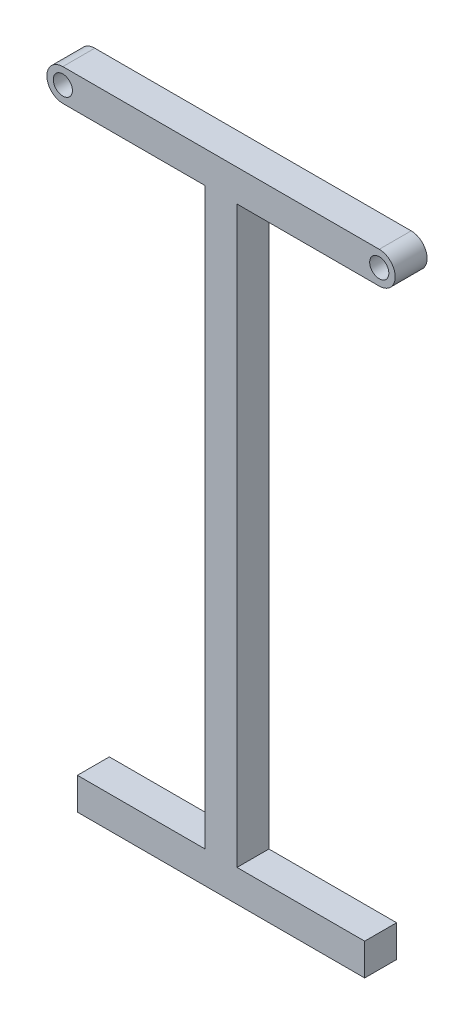
ISO-10303-21;
HEADER;
FILE_DESCRIPTION(('STEP AP214'),'2;1');
FILE_NAME('part.step','',(''),(''),'','','');
FILE_SCHEMA(('AUTOMOTIVE_DESIGN { 1 0 10303 214 1 1 1 1 }'));
ENDSEC;
DATA;
#1=APPLICATION_CONTEXT('core data for automotive mechanical design processes');
#2=APPLICATION_PROTOCOL_DEFINITION('international standard','automotive_design',2000,#1);
#3=PRODUCT_CONTEXT('',#1,'mechanical');
#4=PRODUCT('Part','Part','',(#3));
#5=PRODUCT_RELATED_PRODUCT_CATEGORY('part','',(#4));
#6=PRODUCT_DEFINITION_FORMATION('','',#4);
#7=PRODUCT_DEFINITION_CONTEXT('part definition',#1,'design');
#8=PRODUCT_DEFINITION('design','',#6,#7);
#9=PRODUCT_DEFINITION_SHAPE('','',#8);
#10=(LENGTH_UNIT() NAMED_UNIT(*) SI_UNIT(.MILLI.,.METRE.));
#11=(NAMED_UNIT(*) PLANE_ANGLE_UNIT() SI_UNIT($,.RADIAN.));
#12=(NAMED_UNIT(*) SI_UNIT($,.STERADIAN.) SOLID_ANGLE_UNIT());
#13=UNCERTAINTY_MEASURE_WITH_UNIT(LENGTH_MEASURE(1.E-05),#10,'distance_accuracy_value','');
#14=(GEOMETRIC_REPRESENTATION_CONTEXT(3) GLOBAL_UNCERTAINTY_ASSIGNED_CONTEXT((#13)) GLOBAL_UNIT_ASSIGNED_CONTEXT((#10,
#11,#12)) REPRESENTATION_CONTEXT('',''));
#15=CARTESIAN_POINT('',(0.,0.,0.));
#16=DIRECTION('',(0.,0.,1.));
#17=DIRECTION('',(1.,0.,0.));
#18=AXIS2_PLACEMENT_3D('',#15,#16,#17);
#19=CARTESIAN_POINT('',(-24.78125,47.5,2.5));
#20=DIRECTION('',(0.,0.,1.));
#21=DIRECTION('',(1.,0.,0.));
#22=AXIS2_PLACEMENT_3D('',#19,#20,#21);
#23=PLANE('',#22);
#24=CARTESIAN_POINT('',(24.78125,47.5,2.5));
#25=DIRECTION('',(0.,0.,1.));
#26=DIRECTION('',(1.,0.,0.));
#27=AXIS2_PLACEMENT_3D('',#24,#25,#26);
#28=CIRCLE('',#27,1.49999999999999);
#29=CARTESIAN_POINT('',(26.28125,47.5,2.5));
#30=VERTEX_POINT('',#29);
#31=EDGE_CURVE('E160',#30,#30,#28,.T.);
#32=ORIENTED_EDGE('',*,*,#31,.F.);
#33=EDGE_LOOP('',(#32));
#34=FACE_BOUND('',#33,.T.);
#35=CARTESIAN_POINT('',(-24.78125,47.5,2.5));
#36=DIRECTION('',(0.,0.,1.));
#37=DIRECTION('',(1.,0.,0.));
#38=AXIS2_PLACEMENT_3D('',#35,#36,#37);
#39=CIRCLE('',#38,2.50000000000001);
#40=CARTESIAN_POINT('',(-24.78125,50.,2.5));
#41=VERTEX_POINT('',#40);
#42=CARTESIAN_POINT('',(-24.78125,45.,2.5));
#43=VERTEX_POINT('',#42);
#44=EDGE_CURVE('E179',#41,#43,#39,.T.);
#45=ORIENTED_EDGE('',*,*,#44,.T.);
#46=DIRECTION('',(1.,0.,0.));
#47=VECTOR('',#46,1.);
#48=CARTESIAN_POINT('',(-24.78125,45.,2.5));
#49=LINE('',#48,#47);
#50=CARTESIAN_POINT('',(-2.50000000000002,45.,2.5));
#51=VERTEX_POINT('',#50);
#52=EDGE_CURVE('E107',#43,#51,#49,.T.);
#53=ORIENTED_EDGE('',*,*,#52,.T.);
#54=DIRECTION('',(0.,-1.,0.));
#55=VECTOR('',#54,1.);
#56=CARTESIAN_POINT('',(-2.50000000000002,45.,2.5));
#57=LINE('',#56,#55);
#58=CARTESIAN_POINT('',(-2.50000000000002,-45.,2.5));
#59=VERTEX_POINT('',#58);
#60=EDGE_CURVE('E206',#51,#59,#57,.T.);
#61=ORIENTED_EDGE('',*,*,#60,.T.);
#62=DIRECTION('',(-1.,0.,0.));
#63=VECTOR('',#62,1.);
#64=CARTESIAN_POINT('',(-22.5,-45.,2.5));
#65=LINE('',#64,#63);
#66=CARTESIAN_POINT('',(-22.5,-45.,2.5));
#67=VERTEX_POINT('',#66);
#68=EDGE_CURVE('E225',#59,#67,#65,.T.);
#69=ORIENTED_EDGE('',*,*,#68,.T.);
#70=DIRECTION('',(0.,-1.,0.));
#71=VECTOR('',#70,1.);
#72=CARTESIAN_POINT('',(-22.5,-50.,2.5));
#73=LINE('',#72,#71);
#74=CARTESIAN_POINT('',(-22.5,-50.,2.5));
#75=VERTEX_POINT('',#74);
#76=EDGE_CURVE('E222',#67,#75,#73,.T.);
#77=ORIENTED_EDGE('',*,*,#76,.T.);
#78=DIRECTION('',(1.,0.,0.));
#79=VECTOR('',#78,1.);
#80=CARTESIAN_POINT('',(-22.5,-50.,2.5));
#81=LINE('',#80,#79);
#82=CARTESIAN_POINT('',(22.5,-50.,2.5));
#83=VERTEX_POINT('',#82);
#84=EDGE_CURVE('E224',#75,#83,#81,.T.);
#85=ORIENTED_EDGE('',*,*,#84,.T.);
#86=DIRECTION('',(0.,1.,0.));
#87=VECTOR('',#86,1.);
#88=CARTESIAN_POINT('',(22.5,-50.,2.5));
#89=LINE('',#88,#87);
#90=CARTESIAN_POINT('',(22.5,-45.,2.5));
#91=VERTEX_POINT('',#90);
#92=EDGE_CURVE('E227',#83,#91,#89,.T.);
#93=ORIENTED_EDGE('',*,*,#92,.T.);
#94=DIRECTION('',(-1.,0.,0.));
#95=VECTOR('',#94,1.);
#96=CARTESIAN_POINT('',(2.50000000000002,-45.,2.5));
#97=LINE('',#96,#95);
#98=CARTESIAN_POINT('',(2.50000000000002,-45.,2.5));
#99=VERTEX_POINT('',#98);
#100=EDGE_CURVE('E233',#91,#99,#97,.T.);
#101=ORIENTED_EDGE('',*,*,#100,.T.);
#102=DIRECTION('',(0.,1.,0.));
#103=VECTOR('',#102,1.);
#104=CARTESIAN_POINT('',(2.50000000000002,45.,2.5));
#105=LINE('',#104,#103);
#106=CARTESIAN_POINT('',(2.50000000000002,45.,2.5));
#107=VERTEX_POINT('',#106);
#108=EDGE_CURVE('E138',#99,#107,#105,.T.);
#109=ORIENTED_EDGE('',*,*,#108,.T.);
#110=DIRECTION('',(1.,0.,0.));
#111=VECTOR('',#110,1.);
#112=CARTESIAN_POINT('',(2.50000000000002,45.,2.5));
#113=LINE('',#112,#111);
#114=CARTESIAN_POINT('',(24.78125,45.,2.5));
#115=VERTEX_POINT('',#114);
#116=EDGE_CURVE('E132',#107,#115,#113,.T.);
#117=ORIENTED_EDGE('',*,*,#116,.T.);
#118=CARTESIAN_POINT('',(24.78125,47.5,2.5));
#119=DIRECTION('',(0.,0.,1.));
#120=DIRECTION('',(1.,0.,0.));
#121=AXIS2_PLACEMENT_3D('',#118,#119,#120);
#122=CIRCLE('',#121,2.5);
#123=CARTESIAN_POINT('',(24.78125,50.,2.5));
#124=VERTEX_POINT('',#123);
#125=EDGE_CURVE('E136',#115,#124,#122,.T.);
#126=ORIENTED_EDGE('',*,*,#125,.T.);
#127=DIRECTION('',(-1.,0.,0.));
#128=VECTOR('',#127,1.);
#129=CARTESIAN_POINT('',(-24.78125,50.,2.5));
#130=LINE('',#129,#128);
#131=EDGE_CURVE('E52',#124,#41,#130,.T.);
#132=ORIENTED_EDGE('',*,*,#131,.T.);
#133=EDGE_LOOP('',(#45,#53,#61,#69,#77,#85,#93,#101,#109,#117,#126,#132));
#134=FACE_BOUND('',#133,.T.);
#135=CARTESIAN_POINT('',(-24.78125,47.5,2.5));
#136=DIRECTION('',(0.,0.,1.));
#137=DIRECTION('',(1.,0.,0.));
#138=AXIS2_PLACEMENT_3D('',#135,#136,#137);
#139=CIRCLE('',#138,1.5);
#140=CARTESIAN_POINT('',(-23.28125,47.5,2.5));
#141=VERTEX_POINT('',#140);
#142=EDGE_CURVE('E275',#141,#141,#139,.T.);
#143=ORIENTED_EDGE('',*,*,#142,.F.);
#144=EDGE_LOOP('',(#143));
#145=FACE_BOUND('',#144,.T.);
#146=ADVANCED_FACE('F35',(#34,#134,#145),#23,.T.);
#147=CARTESIAN_POINT('',(-24.78125,47.5,-2.5));
#148=DIRECTION('',(0.,0.,1.));
#149=DIRECTION('',(1.,0.,0.));
#150=AXIS2_PLACEMENT_3D('',#147,#148,#149);
#151=PLANE('',#150);
#152=CARTESIAN_POINT('',(-24.78125,47.5,-2.5));
#153=DIRECTION('',(0.,0.,1.));
#154=DIRECTION('',(1.,0.,0.));
#155=AXIS2_PLACEMENT_3D('',#152,#153,#154);
#156=CIRCLE('',#155,2.50000000000001);
#157=CARTESIAN_POINT('',(-24.78125,50.,-2.5));
#158=VERTEX_POINT('',#157);
#159=CARTESIAN_POINT('',(-24.78125,45.,-2.5));
#160=VERTEX_POINT('',#159);
#161=EDGE_CURVE('E156',#158,#160,#156,.T.);
#162=ORIENTED_EDGE('',*,*,#161,.F.);
#163=DIRECTION('',(-1.,0.,0.));
#164=VECTOR('',#163,1.);
#165=CARTESIAN_POINT('',(-24.78125,50.,-2.5));
#166=LINE('',#165,#164);
#167=CARTESIAN_POINT('',(24.78125,50.,-2.5));
#168=VERTEX_POINT('',#167);
#169=EDGE_CURVE('E99',#168,#158,#166,.T.);
#170=ORIENTED_EDGE('',*,*,#169,.F.);
#171=CARTESIAN_POINT('',(24.78125,47.5,-2.5));
#172=DIRECTION('',(0.,0.,1.));
#173=DIRECTION('',(1.,0.,0.));
#174=AXIS2_PLACEMENT_3D('',#171,#172,#173);
#175=CIRCLE('',#174,2.5);
#176=CARTESIAN_POINT('',(24.78125,45.,-2.5));
#177=VERTEX_POINT('',#176);
#178=EDGE_CURVE('E93',#177,#168,#175,.T.);
#179=ORIENTED_EDGE('',*,*,#178,.F.);
#180=DIRECTION('',(1.,0.,0.));
#181=VECTOR('',#180,1.);
#182=CARTESIAN_POINT('',(2.50000000000002,45.,-2.5));
#183=LINE('',#182,#181);
#184=CARTESIAN_POINT('',(2.50000000000002,45.,-2.5));
#185=VERTEX_POINT('',#184);
#186=EDGE_CURVE('E146',#185,#177,#183,.T.);
#187=ORIENTED_EDGE('',*,*,#186,.F.);
#188=DIRECTION('',(0.,1.,0.));
#189=VECTOR('',#188,1.);
#190=CARTESIAN_POINT('',(2.50000000000002,45.,-2.5));
#191=LINE('',#190,#189);
#192=CARTESIAN_POINT('',(2.50000000000002,-45.,-2.5));
#193=VERTEX_POINT('',#192);
#194=EDGE_CURVE('E174',#193,#185,#191,.T.);
#195=ORIENTED_EDGE('',*,*,#194,.F.);
#196=DIRECTION('',(-1.,0.,0.));
#197=VECTOR('',#196,1.);
#198=CARTESIAN_POINT('',(2.50000000000002,-45.,-2.5));
#199=LINE('',#198,#197);
#200=CARTESIAN_POINT('',(22.5,-45.,-2.5));
#201=VERTEX_POINT('',#200);
#202=EDGE_CURVE('E172',#201,#193,#199,.T.);
#203=ORIENTED_EDGE('',*,*,#202,.F.);
#204=DIRECTION('',(0.,1.,0.));
#205=VECTOR('',#204,1.);
#206=CARTESIAN_POINT('',(22.5,-50.,-2.5));
#207=LINE('',#206,#205);
#208=CARTESIAN_POINT('',(22.5,-50.,-2.5));
#209=VERTEX_POINT('',#208);
#210=EDGE_CURVE('E170',#209,#201,#207,.T.);
#211=ORIENTED_EDGE('',*,*,#210,.F.);
#212=DIRECTION('',(1.,0.,0.));
#213=VECTOR('',#212,1.);
#214=CARTESIAN_POINT('',(-22.5,-50.,-2.5));
#215=LINE('',#214,#213);
#216=CARTESIAN_POINT('',(-22.5,-50.,-2.5));
#217=VERTEX_POINT('',#216);
#218=EDGE_CURVE('E168',#217,#209,#215,.T.);
#219=ORIENTED_EDGE('',*,*,#218,.F.);
#220=DIRECTION('',(0.,-1.,0.));
#221=VECTOR('',#220,1.);
#222=CARTESIAN_POINT('',(-22.5,-50.,-2.5));
#223=LINE('',#222,#221);
#224=CARTESIAN_POINT('',(-22.5,-45.,-2.5));
#225=VERTEX_POINT('',#224);
#226=EDGE_CURVE('E166',#225,#217,#223,.T.);
#227=ORIENTED_EDGE('',*,*,#226,.F.);
#228=DIRECTION('',(-1.,0.,0.));
#229=VECTOR('',#228,1.);
#230=CARTESIAN_POINT('',(-22.5,-45.,-2.5));
#231=LINE('',#230,#229);
#232=CARTESIAN_POINT('',(-2.50000000000002,-45.,-2.5));
#233=VERTEX_POINT('',#232);
#234=EDGE_CURVE('E164',#233,#225,#231,.T.);
#235=ORIENTED_EDGE('',*,*,#234,.F.);
#236=DIRECTION('',(0.,-1.,0.));
#237=VECTOR('',#236,1.);
#238=CARTESIAN_POINT('',(-2.50000000000002,45.,-2.5));
#239=LINE('',#238,#237);
#240=CARTESIAN_POINT('',(-2.50000000000002,45.,-2.5));
#241=VERTEX_POINT('',#240);
#242=EDGE_CURVE('E162',#241,#233,#239,.T.);
#243=ORIENTED_EDGE('',*,*,#242,.F.);
#244=DIRECTION('',(1.,0.,0.));
#245=VECTOR('',#244,1.);
#246=CARTESIAN_POINT('',(-24.78125,45.,-2.5));
#247=LINE('',#246,#245);
#248=EDGE_CURVE('E159',#160,#241,#247,.T.);
#249=ORIENTED_EDGE('',*,*,#248,.F.);
#250=EDGE_LOOP('',(#162,#170,#179,#187,#195,#203,#211,#219,#227,#235,#243,#249));
#251=FACE_BOUND('',#250,.T.);
#252=CARTESIAN_POINT('',(24.78125,47.5,-2.5));
#253=DIRECTION('',(0.,0.,1.));
#254=DIRECTION('',(1.,0.,0.));
#255=AXIS2_PLACEMENT_3D('',#252,#253,#254);
#256=CIRCLE('',#255,1.49999999999999);
#257=CARTESIAN_POINT('',(26.28125,47.5,-2.5));
#258=VERTEX_POINT('',#257);
#259=EDGE_CURVE('E281',#258,#258,#256,.T.);
#260=ORIENTED_EDGE('',*,*,#259,.T.);
#261=EDGE_LOOP('',(#260));
#262=FACE_BOUND('',#261,.T.);
#263=CARTESIAN_POINT('',(-24.78125,47.5,-2.5));
#264=DIRECTION('',(0.,0.,1.));
#265=DIRECTION('',(1.,0.,0.));
#266=AXIS2_PLACEMENT_3D('',#263,#264,#265);
#267=CIRCLE('',#266,1.5);
#268=CARTESIAN_POINT('',(-23.28125,47.5,-2.5));
#269=VERTEX_POINT('',#268);
#270=EDGE_CURVE('E278',#269,#269,#267,.T.);
#271=ORIENTED_EDGE('',*,*,#270,.T.);
#272=EDGE_LOOP('',(#271));
#273=FACE_BOUND('',#272,.T.);
#274=ADVANCED_FACE('F210',(#251,#262,#273),#151,.F.);
#275=CARTESIAN_POINT('',(-24.78125,47.5,2.5));
#276=DIRECTION('',(0.,0.,-1.));
#277=DIRECTION('',(-1.,0.,0.));
#278=AXIS2_PLACEMENT_3D('',#275,#276,#277);
#279=CYLINDRICAL_SURFACE('',#278,2.50000000000001);
#280=ORIENTED_EDGE('',*,*,#161,.T.);
#281=DIRECTION('',(0.,0.,-1.));
#282=VECTOR('',#281,1.);
#283=CARTESIAN_POINT('',(-24.78125,45.,2.5));
#284=LINE('',#283,#282);
#285=EDGE_CURVE('E11',#43,#160,#284,.T.);
#286=ORIENTED_EDGE('',*,*,#285,.F.);
#287=ORIENTED_EDGE('',*,*,#44,.F.);
#288=DIRECTION('',(0.,0.,-1.));
#289=VECTOR('',#288,1.);
#290=CARTESIAN_POINT('',(-24.78125,50.,2.5));
#291=LINE('',#290,#289);
#292=EDGE_CURVE('E152',#41,#158,#291,.T.);
#293=ORIENTED_EDGE('',*,*,#292,.T.);
#294=EDGE_LOOP('',(#280,#286,#287,#293));
#295=FACE_BOUND('',#294,.T.);
#296=ADVANCED_FACE('F37',(#295),#279,.T.);
#297=CARTESIAN_POINT('',(-24.78125,45.,2.5));
#298=DIRECTION('',(0.,1.,0.));
#299=DIRECTION('',(0.,0.,1.));
#300=AXIS2_PLACEMENT_3D('',#297,#298,#299);
#301=PLANE('',#300);
#302=ORIENTED_EDGE('',*,*,#248,.T.);
#303=DIRECTION('',(0.,0.,-1.));
#304=VECTOR('',#303,1.);
#305=CARTESIAN_POINT('',(-2.50000000000002,45.,2.5));
#306=LINE('',#305,#304);
#307=EDGE_CURVE('E44',#51,#241,#306,.T.);
#308=ORIENTED_EDGE('',*,*,#307,.F.);
#309=ORIENTED_EDGE('',*,*,#52,.F.);
#310=ORIENTED_EDGE('',*,*,#285,.T.);
#311=EDGE_LOOP('',(#302,#308,#309,#310));
#312=FACE_BOUND('',#311,.T.);
#313=ADVANCED_FACE('F374',(#312),#301,.F.);
#314=CARTESIAN_POINT('',(-2.50000000000002,45.,2.5));
#315=DIRECTION('',(1.,0.,0.));
#316=DIRECTION('',(0.,0.,-1.));
#317=AXIS2_PLACEMENT_3D('',#314,#315,#316);
#318=PLANE('',#317);
#319=ORIENTED_EDGE('',*,*,#242,.T.);
#320=DIRECTION('',(0.,0.,-1.));
#321=VECTOR('',#320,1.);
#322=CARTESIAN_POINT('',(-2.50000000000002,-45.,2.5));
#323=LINE('',#322,#321);
#324=EDGE_CURVE('E198',#59,#233,#323,.T.);
#325=ORIENTED_EDGE('',*,*,#324,.F.);
#326=ORIENTED_EDGE('',*,*,#60,.F.);
#327=ORIENTED_EDGE('',*,*,#307,.T.);
#328=EDGE_LOOP('',(#319,#325,#326,#327));
#329=FACE_BOUND('',#328,.T.);
#330=ADVANCED_FACE('F204',(#329),#318,.F.);
#331=CARTESIAN_POINT('',(-22.5,-45.,2.5));
#332=DIRECTION('',(0.,-1.,0.));
#333=DIRECTION('',(0.,0.,-1.));
#334=AXIS2_PLACEMENT_3D('',#331,#332,#333);
#335=PLANE('',#334);
#336=ORIENTED_EDGE('',*,*,#234,.T.);
#337=DIRECTION('',(0.,0.,-1.));
#338=VECTOR('',#337,1.);
#339=CARTESIAN_POINT('',(-22.5,-45.,2.5));
#340=LINE('',#339,#338);
#341=EDGE_CURVE('E195',#67,#225,#340,.T.);
#342=ORIENTED_EDGE('',*,*,#341,.F.);
#343=ORIENTED_EDGE('',*,*,#68,.F.);
#344=ORIENTED_EDGE('',*,*,#324,.T.);
#345=EDGE_LOOP('',(#336,#342,#343,#344));
#346=FACE_BOUND('',#345,.T.);
#347=ADVANCED_FACE('F216',(#346),#335,.F.);
#348=CARTESIAN_POINT('',(-22.5,-50.,2.5));
#349=DIRECTION('',(1.,0.,0.));
#350=DIRECTION('',(0.,0.,-1.));
#351=AXIS2_PLACEMENT_3D('',#348,#349,#350);
#352=PLANE('',#351);
#353=ORIENTED_EDGE('',*,*,#226,.T.);
#354=DIRECTION('',(0.,0.,-1.));
#355=VECTOR('',#354,1.);
#356=CARTESIAN_POINT('',(-22.5,-50.,2.5));
#357=LINE('',#356,#355);
#358=EDGE_CURVE('E192',#75,#217,#357,.T.);
#359=ORIENTED_EDGE('',*,*,#358,.F.);
#360=ORIENTED_EDGE('',*,*,#76,.F.);
#361=ORIENTED_EDGE('',*,*,#341,.T.);
#362=EDGE_LOOP('',(#353,#359,#360,#361));
#363=FACE_BOUND('',#362,.T.);
#364=ADVANCED_FACE('F220',(#363),#352,.F.);
#365=CARTESIAN_POINT('',(-22.5,-50.,2.5));
#366=DIRECTION('',(0.,1.,0.));
#367=DIRECTION('',(0.,0.,1.));
#368=AXIS2_PLACEMENT_3D('',#365,#366,#367);
#369=PLANE('',#368);
#370=ORIENTED_EDGE('',*,*,#218,.T.);
#371=DIRECTION('',(0.,0.,-1.));
#372=VECTOR('',#371,1.);
#373=CARTESIAN_POINT('',(22.5,-50.,2.5));
#374=LINE('',#373,#372);
#375=EDGE_CURVE('E189',#83,#209,#374,.T.);
#376=ORIENTED_EDGE('',*,*,#375,.F.);
#377=ORIENTED_EDGE('',*,*,#84,.F.);
#378=ORIENTED_EDGE('',*,*,#358,.T.);
#379=EDGE_LOOP('',(#370,#376,#377,#378));
#380=FACE_BOUND('',#379,.T.);
#381=ADVANCED_FACE('F339',(#380),#369,.F.);
#382=CARTESIAN_POINT('',(22.5,-50.,2.5));
#383=DIRECTION('',(-1.,0.,0.));
#384=DIRECTION('',(0.,0.,1.));
#385=AXIS2_PLACEMENT_3D('',#382,#383,#384);
#386=PLANE('',#385);
#387=ORIENTED_EDGE('',*,*,#210,.T.);
#388=DIRECTION('',(0.,0.,-1.));
#389=VECTOR('',#388,1.);
#390=CARTESIAN_POINT('',(22.5,-45.,2.5));
#391=LINE('',#390,#389);
#392=EDGE_CURVE('E186',#91,#201,#391,.T.);
#393=ORIENTED_EDGE('',*,*,#392,.F.);
#394=ORIENTED_EDGE('',*,*,#92,.F.);
#395=ORIENTED_EDGE('',*,*,#375,.T.);
#396=EDGE_LOOP('',(#387,#393,#394,#395));
#397=FACE_BOUND('',#396,.T.);
#398=ADVANCED_FACE('F330',(#397),#386,.F.);
#399=CARTESIAN_POINT('',(2.50000000000002,-45.,2.5));
#400=DIRECTION('',(0.,-1.,0.));
#401=DIRECTION('',(0.,0.,-1.));
#402=AXIS2_PLACEMENT_3D('',#399,#400,#401);
#403=PLANE('',#402);
#404=ORIENTED_EDGE('',*,*,#202,.T.);
#405=DIRECTION('',(0.,0.,-1.));
#406=VECTOR('',#405,1.);
#407=CARTESIAN_POINT('',(2.50000000000002,-45.,2.5));
#408=LINE('',#407,#406);
#409=EDGE_CURVE('E183',#99,#193,#408,.T.);
#410=ORIENTED_EDGE('',*,*,#409,.F.);
#411=ORIENTED_EDGE('',*,*,#100,.F.);
#412=ORIENTED_EDGE('',*,*,#392,.T.);
#413=EDGE_LOOP('',(#404,#410,#411,#412));
#414=FACE_BOUND('',#413,.T.);
#415=ADVANCED_FACE('F239',(#414),#403,.F.);
#416=CARTESIAN_POINT('',(2.50000000000002,45.,2.5));
#417=DIRECTION('',(-1.,0.,0.));
#418=DIRECTION('',(0.,0.,1.));
#419=AXIS2_PLACEMENT_3D('',#416,#417,#418);
#420=PLANE('',#419);
#421=ORIENTED_EDGE('',*,*,#194,.T.);
#422=DIRECTION('',(0.,0.,-1.));
#423=VECTOR('',#422,1.);
#424=CARTESIAN_POINT('',(2.50000000000002,45.,2.5));
#425=LINE('',#424,#423);
#426=EDGE_CURVE('E147',#107,#185,#425,.T.);
#427=ORIENTED_EDGE('',*,*,#426,.F.);
#428=ORIENTED_EDGE('',*,*,#108,.F.);
#429=ORIENTED_EDGE('',*,*,#409,.T.);
#430=EDGE_LOOP('',(#421,#427,#428,#429));
#431=FACE_BOUND('',#430,.T.);
#432=ADVANCED_FACE('F243',(#431),#420,.F.);
#433=CARTESIAN_POINT('',(2.50000000000002,45.,2.5));
#434=DIRECTION('',(0.,1.,0.));
#435=DIRECTION('',(-1.,0.,0.));
#436=AXIS2_PLACEMENT_3D('',#433,#434,#435);
#437=PLANE('',#436);
#438=ORIENTED_EDGE('',*,*,#186,.T.);
#439=DIRECTION('',(0.,0.,-1.));
#440=VECTOR('',#439,1.);
#441=CARTESIAN_POINT('',(24.78125,45.,2.5));
#442=LINE('',#441,#440);
#443=EDGE_CURVE('E143',#115,#177,#442,.T.);
#444=ORIENTED_EDGE('',*,*,#443,.F.);
#445=ORIENTED_EDGE('',*,*,#116,.F.);
#446=ORIENTED_EDGE('',*,*,#426,.T.);
#447=EDGE_LOOP('',(#438,#444,#445,#446));
#448=FACE_BOUND('',#447,.T.);
#449=ADVANCED_FACE('F144',(#448),#437,.F.);
#450=CARTESIAN_POINT('',(24.78125,47.5,2.5));
#451=DIRECTION('',(0.,0.,-1.));
#452=DIRECTION('',(-1.,0.,0.));
#453=AXIS2_PLACEMENT_3D('',#450,#451,#452);
#454=CYLINDRICAL_SURFACE('',#453,2.5);
#455=ORIENTED_EDGE('',*,*,#178,.T.);
#456=DIRECTION('',(0.,0.,-1.));
#457=VECTOR('',#456,1.);
#458=CARTESIAN_POINT('',(24.78125,50.,2.5));
#459=LINE('',#458,#457);
#460=EDGE_CURVE('E148',#124,#168,#459,.T.);
#461=ORIENTED_EDGE('',*,*,#460,.F.);
#462=ORIENTED_EDGE('',*,*,#125,.F.);
#463=ORIENTED_EDGE('',*,*,#443,.T.);
#464=EDGE_LOOP('',(#455,#461,#462,#463));
#465=FACE_BOUND('',#464,.T.);
#466=ADVANCED_FACE('F150',(#465),#454,.T.);
#467=CARTESIAN_POINT('',(-24.78125,50.,2.5));
#468=DIRECTION('',(0.,-1.,0.));
#469=DIRECTION('',(1.,0.,0.));
#470=AXIS2_PLACEMENT_3D('',#467,#468,#469);
#471=PLANE('',#470);
#472=ORIENTED_EDGE('',*,*,#169,.T.);
#473=ORIENTED_EDGE('',*,*,#292,.F.);
#474=ORIENTED_EDGE('',*,*,#131,.F.);
#475=ORIENTED_EDGE('',*,*,#460,.T.);
#476=EDGE_LOOP('',(#472,#473,#474,#475));
#477=FACE_BOUND('',#476,.T.);
#478=ADVANCED_FACE('F247',(#477),#471,.F.);
#479=CARTESIAN_POINT('',(24.78125,47.5,2.5));
#480=DIRECTION('',(0.,0.,-1.));
#481=DIRECTION('',(-1.,0.,0.));
#482=AXIS2_PLACEMENT_3D('',#479,#480,#481);
#483=CYLINDRICAL_SURFACE('',#482,1.49999999999999);
#484=ORIENTED_EDGE('',*,*,#31,.T.);
#485=EDGE_LOOP('',(#484));
#486=FACE_BOUND('',#485,.T.);
#487=ORIENTED_EDGE('',*,*,#259,.F.);
#488=EDGE_LOOP('',(#487));
#489=FACE_BOUND('',#488,.T.);
#490=ADVANCED_FACE('F249',(#486,#489),#483,.F.);
#491=CARTESIAN_POINT('',(-24.78125,47.5,2.5));
#492=DIRECTION('',(0.,0.,-1.));
#493=DIRECTION('',(-1.,0.,0.));
#494=AXIS2_PLACEMENT_3D('',#491,#492,#493);
#495=CYLINDRICAL_SURFACE('',#494,1.5);
#496=ORIENTED_EDGE('',*,*,#142,.T.);
#497=EDGE_LOOP('',(#496));
#498=FACE_BOUND('',#497,.T.);
#499=ORIENTED_EDGE('',*,*,#270,.F.);
#500=EDGE_LOOP('',(#499));
#501=FACE_BOUND('',#500,.T.);
#502=ADVANCED_FACE('F255',(#498,#501),#495,.F.);
#503=CLOSED_SHELL('',(#146,#274,#296,#313,#330,#347,#364,#381,#398,#415,#432,#449,#466,#478,
#490,#502));
#504=MANIFOLD_SOLID_BREP('B2',#503);
#505=ADVANCED_BREP_SHAPE_REPRESENTATION('',(#18,#504),#14);
#506=SHAPE_DEFINITION_REPRESENTATION(#9,#505);
ENDSEC;
END-ISO-10303-21;
